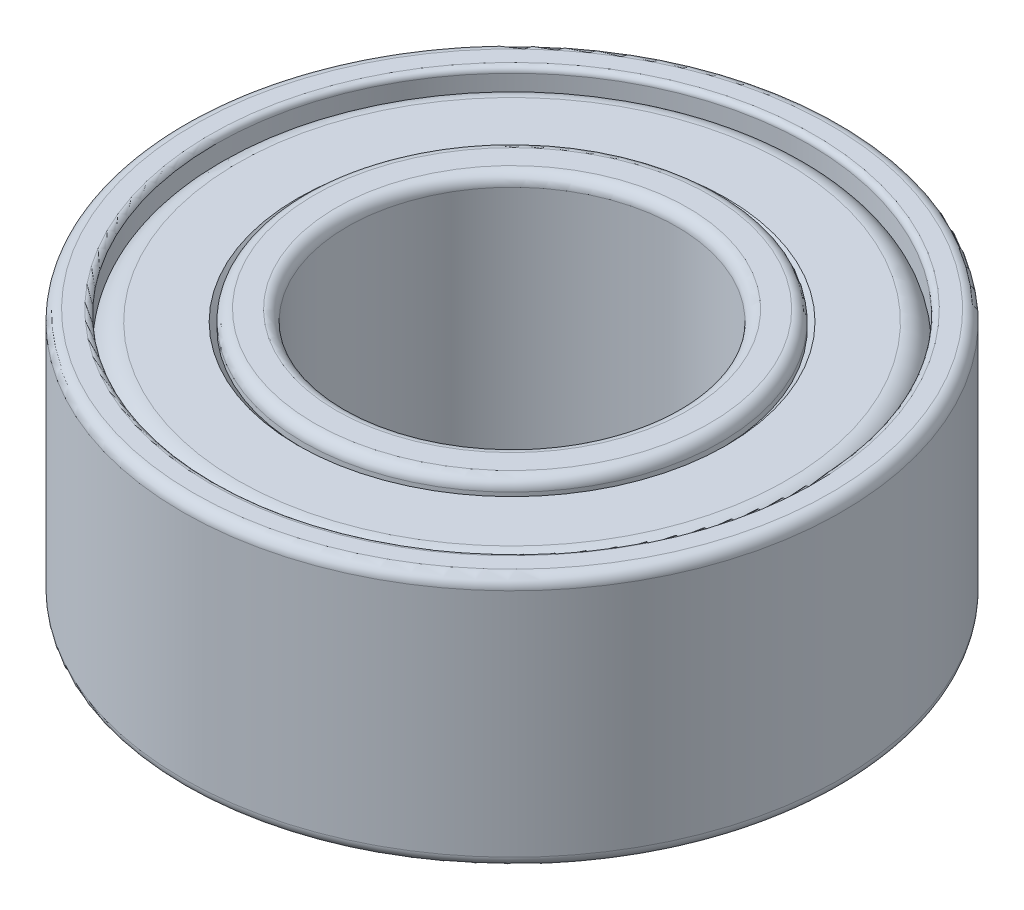
ISO-10303-21;
HEADER;
FILE_DESCRIPTION(('STEP AP214'),'2;1');
FILE_NAME('part.step','',(''),(''),'','','');
FILE_SCHEMA(('AUTOMOTIVE_DESIGN { 1 0 10303 214 1 1 1 1 }'));
ENDSEC;
DATA;
#1=APPLICATION_CONTEXT('core data for automotive mechanical design processes');
#2=APPLICATION_PROTOCOL_DEFINITION('international standard','automotive_design',2000,#1);
#3=PRODUCT_CONTEXT('',#1,'mechanical');
#4=PRODUCT('Part','Part','',(#3));
#5=PRODUCT_RELATED_PRODUCT_CATEGORY('part','',(#4));
#6=PRODUCT_DEFINITION_FORMATION('','',#4);
#7=PRODUCT_DEFINITION_CONTEXT('part definition',#1,'design');
#8=PRODUCT_DEFINITION('design','',#6,#7);
#9=PRODUCT_DEFINITION_SHAPE('','',#8);
#10=(LENGTH_UNIT() NAMED_UNIT(*) SI_UNIT(.MILLI.,.METRE.));
#11=(NAMED_UNIT(*) PLANE_ANGLE_UNIT() SI_UNIT($,.RADIAN.));
#12=(NAMED_UNIT(*) SI_UNIT($,.STERADIAN.) SOLID_ANGLE_UNIT());
#13=UNCERTAINTY_MEASURE_WITH_UNIT(LENGTH_MEASURE(1.E-05),#10,'distance_accuracy_value','');
#14=(GEOMETRIC_REPRESENTATION_CONTEXT(3) GLOBAL_UNCERTAINTY_ASSIGNED_CONTEXT((#13)) GLOBAL_UNIT_ASSIGNED_CONTEXT((#10,
#11,#12)) REPRESENTATION_CONTEXT('',''));
#15=CARTESIAN_POINT('',(0.,0.,0.));
#16=DIRECTION('',(0.,0.,1.));
#17=DIRECTION('',(1.,0.,0.));
#18=AXIS2_PLACEMENT_3D('',#15,#16,#17);
#19=CARTESIAN_POINT('',(0.,1.05,0.));
#20=DIRECTION('',(0.,1.,0.));
#21=DIRECTION('',(0.,0.,1.));
#22=AXIS2_PLACEMENT_3D('',#19,#20,#21);
#23=PLANE('',#22);
#24=CARTESIAN_POINT('',(0.,1.05,0.));
#25=DIRECTION('',(0.,1.,0.));
#26=DIRECTION('',(0.,0.,1.));
#27=AXIS2_PLACEMENT_3D('',#24,#25,#26);
#28=CIRCLE('',#27,1.95);
#29=CARTESIAN_POINT('',(0.,1.05,1.95));
#30=VERTEX_POINT('',#29);
#31=EDGE_CURVE('E11',#30,#30,#28,.F.);
#32=ORIENTED_EDGE('',*,*,#31,.T.);
#33=EDGE_LOOP('',(#32));
#34=FACE_BOUND('',#33,.T.);
#35=CARTESIAN_POINT('',(0.,1.05,0.));
#36=DIRECTION('',(0.,1.,0.));
#37=DIRECTION('',(0.,0.,1.));
#38=AXIS2_PLACEMENT_3D('',#35,#36,#37);
#39=CIRCLE('',#38,2.5);
#40=CARTESIAN_POINT('',(0.,1.05,2.5));
#41=VERTEX_POINT('',#40);
#42=EDGE_CURVE('E64',#41,#41,#39,.T.);
#43=ORIENTED_EDGE('',*,*,#42,.T.);
#44=EDGE_LOOP('',(#43));
#45=FACE_BOUND('',#44,.T.);
#46=ADVANCED_FACE('F44',(#34,#45),#23,.T.);
#47=CARTESIAN_POINT('',(0.,-1.05,0.));
#48=DIRECTION('',(0.,1.,0.));
#49=DIRECTION('',(0.,0.,1.));
#50=AXIS2_PLACEMENT_3D('',#47,#48,#49);
#51=PLANE('',#50);
#52=CARTESIAN_POINT('',(0.,-1.05,0.));
#53=DIRECTION('',(0.,1.,0.));
#54=DIRECTION('',(0.,0.,1.));
#55=AXIS2_PLACEMENT_3D('',#52,#53,#54);
#56=CIRCLE('',#55,1.95);
#57=CARTESIAN_POINT('',(0.,-1.05,1.95));
#58=VERTEX_POINT('',#57);
#59=EDGE_CURVE('E59',#58,#58,#56,.T.);
#60=ORIENTED_EDGE('',*,*,#59,.T.);
#61=EDGE_LOOP('',(#60));
#62=FACE_BOUND('',#61,.T.);
#63=CARTESIAN_POINT('',(0.,-1.05,0.));
#64=DIRECTION('',(0.,1.,0.));
#65=DIRECTION('',(0.,0.,1.));
#66=AXIS2_PLACEMENT_3D('',#63,#64,#65);
#67=CIRCLE('',#66,2.5);
#68=CARTESIAN_POINT('',(0.,-1.05,2.5));
#69=VERTEX_POINT('',#68);
#70=EDGE_CURVE('E67',#69,#69,#67,.F.);
#71=ORIENTED_EDGE('',*,*,#70,.T.);
#72=EDGE_LOOP('',(#71));
#73=FACE_BOUND('',#72,.T.);
#74=ADVANCED_FACE('F88',(#62,#73),#51,.F.);
#75=CARTESIAN_POINT('',(0.,1.05,0.));
#76=DIRECTION('',(0.,-1.,0.));
#77=DIRECTION('',(0.,0.,-1.));
#78=AXIS2_PLACEMENT_3D('',#75,#76,#77);
#79=CYLINDRICAL_SURFACE('',#78,2.7);
#80=CARTESIAN_POINT('',(0.,-0.85,0.));
#81=DIRECTION('',(0.,1.,0.));
#82=DIRECTION('',(0.,0.,1.));
#83=AXIS2_PLACEMENT_3D('',#80,#81,#82);
#84=CIRCLE('',#83,2.7);
#85=CARTESIAN_POINT('',(0.,-0.85,2.7));
#86=VERTEX_POINT('',#85);
#87=EDGE_CURVE('E70',#86,#86,#84,.T.);
#88=ORIENTED_EDGE('',*,*,#87,.T.);
#89=EDGE_LOOP('',(#88));
#90=FACE_BOUND('',#89,.T.);
#91=CARTESIAN_POINT('',(0.,0.85,0.));
#92=DIRECTION('',(0.,1.,0.));
#93=DIRECTION('',(0.,0.,1.));
#94=AXIS2_PLACEMENT_3D('',#91,#92,#93);
#95=CIRCLE('',#94,2.7);
#96=CARTESIAN_POINT('',(0.,0.85,2.7));
#97=VERTEX_POINT('',#96);
#98=EDGE_CURVE('E73',#97,#97,#95,.F.);
#99=ORIENTED_EDGE('',*,*,#98,.T.);
#100=EDGE_LOOP('',(#99));
#101=FACE_BOUND('',#100,.T.);
#102=ADVANCED_FACE('F77',(#90,#101),#79,.T.);
#103=CARTESIAN_POINT('',(0.,1.05,0.));
#104=DIRECTION('',(0.,-1.,0.));
#105=DIRECTION('',(0.,0.,-1.));
#106=AXIS2_PLACEMENT_3D('',#103,#104,#105);
#107=CYLINDRICAL_SURFACE('',#106,1.9);
#108=CARTESIAN_POINT('',(0.,-1.,0.));
#109=DIRECTION('',(0.,1.,0.));
#110=DIRECTION('',(0.,0.,1.));
#111=AXIS2_PLACEMENT_3D('',#108,#109,#110);
#112=CIRCLE('',#111,1.9);
#113=CARTESIAN_POINT('',(0.,-1.,1.9));
#114=VERTEX_POINT('',#113);
#115=EDGE_CURVE('E51',#114,#114,#112,.F.);
#116=ORIENTED_EDGE('',*,*,#115,.T.);
#117=EDGE_LOOP('',(#116));
#118=FACE_BOUND('',#117,.T.);
#119=CARTESIAN_POINT('',(0.,1.,0.));
#120=DIRECTION('',(0.,1.,0.));
#121=DIRECTION('',(0.,0.,1.));
#122=AXIS2_PLACEMENT_3D('',#119,#120,#121);
#123=CIRCLE('',#122,1.9);
#124=CARTESIAN_POINT('',(0.,1.,1.9));
#125=VERTEX_POINT('',#124);
#126=EDGE_CURVE('E55',#125,#125,#123,.T.);
#127=ORIENTED_EDGE('',*,*,#126,.T.);
#128=EDGE_LOOP('',(#127));
#129=FACE_BOUND('',#128,.T.);
#130=ADVANCED_FACE('F96',(#118,#129),#107,.F.);
#131=CARTESIAN_POINT('',(0.,-0.85,0.));
#132=DIRECTION('',(0.,1.,0.));
#133=DIRECTION('',(0.,0.,1.));
#134=AXIS2_PLACEMENT_3D('',#131,#132,#133);
#135=TOROIDAL_SURFACE('',#134,2.5,0.2);
#136=ORIENTED_EDGE('',*,*,#70,.F.);
#137=EDGE_LOOP('',(#136));
#138=FACE_BOUND('',#137,.T.);
#139=ORIENTED_EDGE('',*,*,#87,.F.);
#140=EDGE_LOOP('',(#139));
#141=FACE_BOUND('',#140,.T.);
#142=ADVANCED_FACE('F83',(#138,#141),#135,.T.);
#143=CARTESIAN_POINT('',(0.,0.85,0.));
#144=DIRECTION('',(0.,1.,0.));
#145=DIRECTION('',(0.,0.,1.));
#146=AXIS2_PLACEMENT_3D('',#143,#144,#145);
#147=TOROIDAL_SURFACE('',#146,2.5,0.2);
#148=ORIENTED_EDGE('',*,*,#98,.F.);
#149=EDGE_LOOP('',(#148));
#150=FACE_BOUND('',#149,.T.);
#151=ORIENTED_EDGE('',*,*,#42,.F.);
#152=EDGE_LOOP('',(#151));
#153=FACE_BOUND('',#152,.T.);
#154=ADVANCED_FACE('F79',(#150,#153),#147,.T.);
#155=CARTESIAN_POINT('',(0.,-1.05,0.));
#156=DIRECTION('',(0.,-1.,0.));
#157=DIRECTION('',(0.,0.,-1.));
#158=AXIS2_PLACEMENT_3D('',#155,#156,#157);
#159=CONICAL_SURFACE('',#158,1.95,0.785398163397453);
#160=ORIENTED_EDGE('',*,*,#115,.F.);
#161=EDGE_LOOP('',(#160));
#162=FACE_BOUND('',#161,.T.);
#163=ORIENTED_EDGE('',*,*,#59,.F.);
#164=EDGE_LOOP('',(#163));
#165=FACE_BOUND('',#164,.T.);
#166=ADVANCED_FACE('F82',(#162,#165),#159,.F.);
#167=CARTESIAN_POINT('',(0.,1.,0.));
#168=DIRECTION('',(0.,1.,0.));
#169=DIRECTION('',(0.,0.,1.));
#170=AXIS2_PLACEMENT_3D('',#167,#168,#169);
#171=CONICAL_SURFACE('',#170,1.9,0.785398163397446);
#172=ORIENTED_EDGE('',*,*,#31,.F.);
#173=EDGE_LOOP('',(#172));
#174=FACE_BOUND('',#173,.T.);
#175=ORIENTED_EDGE('',*,*,#126,.F.);
#176=EDGE_LOOP('',(#175));
#177=FACE_BOUND('',#176,.T.);
#178=ADVANCED_FACE('F46',(#174,#177),#171,.F.);
#179=CLOSED_SHELL('',(#46,#74,#102,#130,#142,#154,#166,#178));
#180=MANIFOLD_SOLID_BREP('B2',#179);
#181=CARTESIAN_POINT('',(0.,1.15,0.));
#182=DIRECTION('',(0.,1.,0.));
#183=DIRECTION('',(0.,0.,1.));
#184=AXIS2_PLACEMENT_3D('',#181,#182,#183);
#185=PLANE('',#184);
#186=CARTESIAN_POINT('',(0.,1.15,0.));
#187=DIRECTION('',(0.,1.,0.));
#188=DIRECTION('',(0.,0.,1.));
#189=AXIS2_PLACEMENT_3D('',#186,#187,#188);
#190=CIRCLE('',#189,2.75);
#191=CARTESIAN_POINT('',(0.,1.15,2.75));
#192=VERTEX_POINT('',#191);
#193=EDGE_CURVE('E43',#192,#192,#190,.F.);
#194=ORIENTED_EDGE('',*,*,#193,.T.);
#195=EDGE_LOOP('',(#194));
#196=FACE_BOUND('',#195,.T.);
#197=CARTESIAN_POINT('',(0.,1.15,0.));
#198=DIRECTION('',(0.,1.,0.));
#199=DIRECTION('',(0.,0.,1.));
#200=AXIS2_PLACEMENT_3D('',#197,#198,#199);
#201=CIRCLE('',#200,2.9);
#202=CARTESIAN_POINT('',(0.,1.15,2.9));
#203=VERTEX_POINT('',#202);
#204=EDGE_CURVE('E193',#203,#203,#201,.T.);
#205=ORIENTED_EDGE('',*,*,#204,.T.);
#206=EDGE_LOOP('',(#205));
#207=FACE_BOUND('',#206,.T.);
#208=ADVANCED_FACE('F173',(#196,#207),#185,.T.);
#209=CARTESIAN_POINT('',(0.,-1.15,0.));
#210=DIRECTION('',(0.,1.,0.));
#211=DIRECTION('',(0.,0.,1.));
#212=AXIS2_PLACEMENT_3D('',#209,#210,#211);
#213=PLANE('',#212);
#214=CARTESIAN_POINT('',(0.,-1.15,0.));
#215=DIRECTION('',(0.,1.,0.));
#216=DIRECTION('',(0.,0.,1.));
#217=AXIS2_PLACEMENT_3D('',#214,#215,#216);
#218=CIRCLE('',#217,2.75);
#219=CARTESIAN_POINT('',(0.,-1.15,2.75));
#220=VERTEX_POINT('',#219);
#221=EDGE_CURVE('E188',#220,#220,#218,.T.);
#222=ORIENTED_EDGE('',*,*,#221,.T.);
#223=EDGE_LOOP('',(#222));
#224=FACE_BOUND('',#223,.T.);
#225=CARTESIAN_POINT('',(0.,-1.15,0.));
#226=DIRECTION('',(0.,1.,0.));
#227=DIRECTION('',(0.,0.,1.));
#228=AXIS2_PLACEMENT_3D('',#225,#226,#227);
#229=CIRCLE('',#228,2.9);
#230=CARTESIAN_POINT('',(0.,-1.15,2.9));
#231=VERTEX_POINT('',#230);
#232=EDGE_CURVE('E196',#231,#231,#229,.F.);
#233=ORIENTED_EDGE('',*,*,#232,.T.);
#234=EDGE_LOOP('',(#233));
#235=FACE_BOUND('',#234,.T.);
#236=ADVANCED_FACE('F217',(#224,#235),#213,.F.);
#237=CARTESIAN_POINT('',(0.,1.15,0.));
#238=DIRECTION('',(0.,-1.,0.));
#239=DIRECTION('',(0.,0.,-1.));
#240=AXIS2_PLACEMENT_3D('',#237,#238,#239);
#241=CYLINDRICAL_SURFACE('',#240,3.);
#242=CARTESIAN_POINT('',(0.,-1.05,0.));
#243=DIRECTION('',(0.,1.,0.));
#244=DIRECTION('',(0.,0.,1.));
#245=AXIS2_PLACEMENT_3D('',#242,#243,#244);
#246=CIRCLE('',#245,3.);
#247=CARTESIAN_POINT('',(0.,-1.05,3.));
#248=VERTEX_POINT('',#247);
#249=EDGE_CURVE('E199',#248,#248,#246,.T.);
#250=ORIENTED_EDGE('',*,*,#249,.T.);
#251=EDGE_LOOP('',(#250));
#252=FACE_BOUND('',#251,.T.);
#253=CARTESIAN_POINT('',(0.,1.05,0.));
#254=DIRECTION('',(0.,1.,0.));
#255=DIRECTION('',(0.,0.,1.));
#256=AXIS2_PLACEMENT_3D('',#253,#254,#255);
#257=CIRCLE('',#256,3.);
#258=CARTESIAN_POINT('',(0.,1.05,3.));
#259=VERTEX_POINT('',#258);
#260=EDGE_CURVE('E202',#259,#259,#257,.F.);
#261=ORIENTED_EDGE('',*,*,#260,.T.);
#262=EDGE_LOOP('',(#261));
#263=FACE_BOUND('',#262,.T.);
#264=ADVANCED_FACE('F206',(#252,#263),#241,.T.);
#265=CARTESIAN_POINT('',(0.,1.15,0.));
#266=DIRECTION('',(0.,-1.,0.));
#267=DIRECTION('',(0.,0.,-1.));
#268=AXIS2_PLACEMENT_3D('',#265,#266,#267);
#269=CYLINDRICAL_SURFACE('',#268,2.7);
#270=CARTESIAN_POINT('',(0.,-1.1,0.));
#271=DIRECTION('',(0.,1.,0.));
#272=DIRECTION('',(0.,0.,1.));
#273=AXIS2_PLACEMENT_3D('',#270,#271,#272);
#274=CIRCLE('',#273,2.7);
#275=CARTESIAN_POINT('',(0.,-1.1,2.7));
#276=VERTEX_POINT('',#275);
#277=EDGE_CURVE('E180',#276,#276,#274,.F.);
#278=ORIENTED_EDGE('',*,*,#277,.T.);
#279=EDGE_LOOP('',(#278));
#280=FACE_BOUND('',#279,.T.);
#281=CARTESIAN_POINT('',(0.,1.1,0.));
#282=DIRECTION('',(0.,1.,0.));
#283=DIRECTION('',(0.,0.,1.));
#284=AXIS2_PLACEMENT_3D('',#281,#282,#283);
#285=CIRCLE('',#284,2.7);
#286=CARTESIAN_POINT('',(0.,1.1,2.7));
#287=VERTEX_POINT('',#286);
#288=EDGE_CURVE('E184',#287,#287,#285,.T.);
#289=ORIENTED_EDGE('',*,*,#288,.T.);
#290=EDGE_LOOP('',(#289));
#291=FACE_BOUND('',#290,.T.);
#292=ADVANCED_FACE('F225',(#280,#291),#269,.F.);
#293=CARTESIAN_POINT('',(0.,-1.05,0.));
#294=DIRECTION('',(0.,1.,0.));
#295=DIRECTION('',(0.,0.,1.));
#296=AXIS2_PLACEMENT_3D('',#293,#294,#295);
#297=TOROIDAL_SURFACE('',#296,2.9,0.1);
#298=ORIENTED_EDGE('',*,*,#232,.F.);
#299=EDGE_LOOP('',(#298));
#300=FACE_BOUND('',#299,.T.);
#301=ORIENTED_EDGE('',*,*,#249,.F.);
#302=EDGE_LOOP('',(#301));
#303=FACE_BOUND('',#302,.T.);
#304=ADVANCED_FACE('F212',(#300,#303),#297,.T.);
#305=CARTESIAN_POINT('',(0.,1.05,0.));
#306=DIRECTION('',(0.,1.,0.));
#307=DIRECTION('',(0.,0.,1.));
#308=AXIS2_PLACEMENT_3D('',#305,#306,#307);
#309=TOROIDAL_SURFACE('',#308,2.9,0.1);
#310=ORIENTED_EDGE('',*,*,#260,.F.);
#311=EDGE_LOOP('',(#310));
#312=FACE_BOUND('',#311,.T.);
#313=ORIENTED_EDGE('',*,*,#204,.F.);
#314=EDGE_LOOP('',(#313));
#315=FACE_BOUND('',#314,.T.);
#316=ADVANCED_FACE('F208',(#312,#315),#309,.T.);
#317=CARTESIAN_POINT('',(0.,-1.1,0.));
#318=DIRECTION('',(0.,1.,0.));
#319=DIRECTION('',(0.,0.,1.));
#320=AXIS2_PLACEMENT_3D('',#317,#318,#319);
#321=TOROIDAL_SURFACE('',#320,2.75,0.05);
#322=ORIENTED_EDGE('',*,*,#277,.F.);
#323=EDGE_LOOP('',(#322));
#324=FACE_BOUND('',#323,.T.);
#325=ORIENTED_EDGE('',*,*,#221,.F.);
#326=EDGE_LOOP('',(#325));
#327=FACE_BOUND('',#326,.T.);
#328=ADVANCED_FACE('F211',(#324,#327),#321,.T.);
#329=CARTESIAN_POINT('',(0.,1.1,0.));
#330=DIRECTION('',(0.,1.,0.));
#331=DIRECTION('',(0.,0.,1.));
#332=AXIS2_PLACEMENT_3D('',#329,#330,#331);
#333=TOROIDAL_SURFACE('',#332,2.75,0.05);
#334=ORIENTED_EDGE('',*,*,#193,.F.);
#335=EDGE_LOOP('',(#334));
#336=FACE_BOUND('',#335,.T.);
#337=ORIENTED_EDGE('',*,*,#288,.F.);
#338=EDGE_LOOP('',(#337));
#339=FACE_BOUND('',#338,.T.);
#340=ADVANCED_FACE('F175',(#336,#339),#333,.T.);
#341=CLOSED_SHELL('',(#208,#236,#264,#292,#304,#316,#328,#340));
#342=MANIFOLD_SOLID_BREP('B6',#341);
#343=CARTESIAN_POINT('',(0.,1.15,0.));
#344=DIRECTION('',(0.,1.,0.));
#345=DIRECTION('',(0.,0.,1.));
#346=AXIS2_PLACEMENT_3D('',#343,#344,#345);
#347=PLANE('',#346);
#348=CARTESIAN_POINT('',(0.,1.15,0.));
#349=DIRECTION('',(0.,1.,0.));
#350=DIRECTION('',(0.,0.,1.));
#351=AXIS2_PLACEMENT_3D('',#348,#349,#350);
#352=CIRCLE('',#351,1.6);
#353=CARTESIAN_POINT('',(0.,1.15,1.6));
#354=VERTEX_POINT('',#353);
#355=EDGE_CURVE('E172',#354,#354,#352,.F.);
#356=ORIENTED_EDGE('',*,*,#355,.T.);
#357=EDGE_LOOP('',(#356));
#358=FACE_BOUND('',#357,.T.);
#359=CARTESIAN_POINT('',(0.,1.15,0.));
#360=DIRECTION('',(0.,1.,0.));
#361=DIRECTION('',(0.,0.,1.));
#362=AXIS2_PLACEMENT_3D('',#359,#360,#361);
#363=CIRCLE('',#362,1.8);
#364=CARTESIAN_POINT('',(0.,1.15,1.8));
#365=VERTEX_POINT('',#364);
#366=EDGE_CURVE('E302',#365,#365,#363,.T.);
#367=ORIENTED_EDGE('',*,*,#366,.T.);
#368=EDGE_LOOP('',(#367));
#369=FACE_BOUND('',#368,.T.);
#370=ADVANCED_FACE('F295',(#358,#369),#347,.T.);
#371=CARTESIAN_POINT('',(0.,-1.15,0.));
#372=DIRECTION('',(0.,1.,0.));
#373=DIRECTION('',(0.,0.,1.));
#374=AXIS2_PLACEMENT_3D('',#371,#372,#373);
#375=PLANE('',#374);
#376=CARTESIAN_POINT('',(0.,-1.15,0.));
#377=DIRECTION('',(0.,1.,0.));
#378=DIRECTION('',(0.,0.,1.));
#379=AXIS2_PLACEMENT_3D('',#376,#377,#378);
#380=CIRCLE('',#379,1.6);
#381=CARTESIAN_POINT('',(0.,-1.15,1.6));
#382=VERTEX_POINT('',#381);
#383=EDGE_CURVE('E321',#382,#382,#380,.T.);
#384=ORIENTED_EDGE('',*,*,#383,.T.);
#385=EDGE_LOOP('',(#384));
#386=FACE_BOUND('',#385,.T.);
#387=CARTESIAN_POINT('',(0.,-1.15,0.));
#388=DIRECTION('',(0.,1.,0.));
#389=DIRECTION('',(0.,0.,1.));
#390=AXIS2_PLACEMENT_3D('',#387,#388,#389);
#391=CIRCLE('',#390,1.8);
#392=CARTESIAN_POINT('',(0.,-1.15,1.8));
#393=VERTEX_POINT('',#392);
#394=EDGE_CURVE('E324',#393,#393,#391,.F.);
#395=ORIENTED_EDGE('',*,*,#394,.T.);
#396=EDGE_LOOP('',(#395));
#397=FACE_BOUND('',#396,.T.);
#398=ADVANCED_FACE('F328',(#386,#397),#375,.F.);
#399=CARTESIAN_POINT('',(0.,1.15,0.));
#400=DIRECTION('',(0.,-1.,0.));
#401=DIRECTION('',(0.,0.,-1.));
#402=AXIS2_PLACEMENT_3D('',#399,#400,#401);
#403=CYLINDRICAL_SURFACE('',#402,1.9);
#404=CARTESIAN_POINT('',(0.,-1.05,0.));
#405=DIRECTION('',(0.,1.,0.));
#406=DIRECTION('',(0.,0.,1.));
#407=AXIS2_PLACEMENT_3D('',#404,#405,#406);
#408=CIRCLE('',#407,1.9);
#409=CARTESIAN_POINT('',(0.,-1.05,1.9));
#410=VERTEX_POINT('',#409);
#411=EDGE_CURVE('E306',#410,#410,#408,.T.);
#412=ORIENTED_EDGE('',*,*,#411,.T.);
#413=EDGE_LOOP('',(#412));
#414=FACE_BOUND('',#413,.T.);
#415=CARTESIAN_POINT('',(0.,1.05,0.));
#416=DIRECTION('',(0.,1.,0.));
#417=DIRECTION('',(0.,0.,1.));
#418=AXIS2_PLACEMENT_3D('',#415,#416,#417);
#419=CIRCLE('',#418,1.9);
#420=CARTESIAN_POINT('',(0.,1.05,1.9));
#421=VERTEX_POINT('',#420);
#422=EDGE_CURVE('E310',#421,#421,#419,.F.);
#423=ORIENTED_EDGE('',*,*,#422,.T.);
#424=EDGE_LOOP('',(#423));
#425=FACE_BOUND('',#424,.T.);
#426=ADVANCED_FACE('F338',(#414,#425),#403,.T.);
#427=CARTESIAN_POINT('',(0.,1.15,0.));
#428=DIRECTION('',(0.,-1.,0.));
#429=DIRECTION('',(0.,0.,-1.));
#430=AXIS2_PLACEMENT_3D('',#427,#428,#429);
#431=CYLINDRICAL_SURFACE('',#430,1.5);
#432=CARTESIAN_POINT('',(0.,-1.05,0.));
#433=DIRECTION('',(0.,1.,0.));
#434=DIRECTION('',(0.,0.,1.));
#435=AXIS2_PLACEMENT_3D('',#432,#433,#434);
#436=CIRCLE('',#435,1.5);
#437=CARTESIAN_POINT('',(0.,-1.05,1.5));
#438=VERTEX_POINT('',#437);
#439=EDGE_CURVE('E315',#438,#438,#436,.F.);
#440=ORIENTED_EDGE('',*,*,#439,.T.);
#441=EDGE_LOOP('',(#440));
#442=FACE_BOUND('',#441,.T.);
#443=CARTESIAN_POINT('',(0.,1.05,0.));
#444=DIRECTION('',(0.,1.,0.));
#445=DIRECTION('',(0.,0.,1.));
#446=AXIS2_PLACEMENT_3D('',#443,#444,#445);
#447=CIRCLE('',#446,1.5);
#448=CARTESIAN_POINT('',(0.,1.05,1.5));
#449=VERTEX_POINT('',#448);
#450=EDGE_CURVE('E318',#449,#449,#447,.T.);
#451=ORIENTED_EDGE('',*,*,#450,.T.);
#452=EDGE_LOOP('',(#451));
#453=FACE_BOUND('',#452,.T.);
#454=ADVANCED_FACE('F341',(#442,#453),#431,.F.);
#455=CARTESIAN_POINT('',(0.,-1.05,0.));
#456=DIRECTION('',(0.,1.,0.));
#457=DIRECTION('',(0.,0.,1.));
#458=AXIS2_PLACEMENT_3D('',#455,#456,#457);
#459=TOROIDAL_SURFACE('',#458,1.6,0.1);
#460=ORIENTED_EDGE('',*,*,#439,.F.);
#461=EDGE_LOOP('',(#460));
#462=FACE_BOUND('',#461,.T.);
#463=ORIENTED_EDGE('',*,*,#383,.F.);
#464=EDGE_LOOP('',(#463));
#465=FACE_BOUND('',#464,.T.);
#466=ADVANCED_FACE('F334',(#462,#465),#459,.T.);
#467=CARTESIAN_POINT('',(0.,-1.05,0.));
#468=DIRECTION('',(0.,1.,0.));
#469=DIRECTION('',(0.,0.,1.));
#470=AXIS2_PLACEMENT_3D('',#467,#468,#469);
#471=TOROIDAL_SURFACE('',#470,1.8,0.1);
#472=ORIENTED_EDGE('',*,*,#394,.F.);
#473=EDGE_LOOP('',(#472));
#474=FACE_BOUND('',#473,.T.);
#475=ORIENTED_EDGE('',*,*,#411,.F.);
#476=EDGE_LOOP('',(#475));
#477=FACE_BOUND('',#476,.T.);
#478=ADVANCED_FACE('F330',(#474,#477),#471,.T.);
#479=CARTESIAN_POINT('',(0.,1.05,0.));
#480=DIRECTION('',(0.,1.,0.));
#481=DIRECTION('',(0.,0.,1.));
#482=AXIS2_PLACEMENT_3D('',#479,#480,#481);
#483=TOROIDAL_SURFACE('',#482,1.6,0.1);
#484=ORIENTED_EDGE('',*,*,#355,.F.);
#485=EDGE_LOOP('',(#484));
#486=FACE_BOUND('',#485,.T.);
#487=ORIENTED_EDGE('',*,*,#450,.F.);
#488=EDGE_LOOP('',(#487));
#489=FACE_BOUND('',#488,.T.);
#490=ADVANCED_FACE('F333',(#486,#489),#483,.T.);
#491=CARTESIAN_POINT('',(0.,1.05,0.));
#492=DIRECTION('',(0.,1.,0.));
#493=DIRECTION('',(0.,0.,1.));
#494=AXIS2_PLACEMENT_3D('',#491,#492,#493);
#495=TOROIDAL_SURFACE('',#494,1.8,0.1);
#496=ORIENTED_EDGE('',*,*,#422,.F.);
#497=EDGE_LOOP('',(#496));
#498=FACE_BOUND('',#497,.T.);
#499=ORIENTED_EDGE('',*,*,#366,.F.);
#500=EDGE_LOOP('',(#499));
#501=FACE_BOUND('',#500,.T.);
#502=ADVANCED_FACE('F297',(#498,#501),#495,.T.);
#503=CLOSED_SHELL('',(#370,#398,#426,#454,#466,#478,#490,#502));
#504=MANIFOLD_SOLID_BREP('B38',#503);
#505=ADVANCED_BREP_SHAPE_REPRESENTATION('',(#18,#180,#342,#504),#14);
#506=SHAPE_DEFINITION_REPRESENTATION(#9,#505);
ENDSEC;
END-ISO-10303-21;
